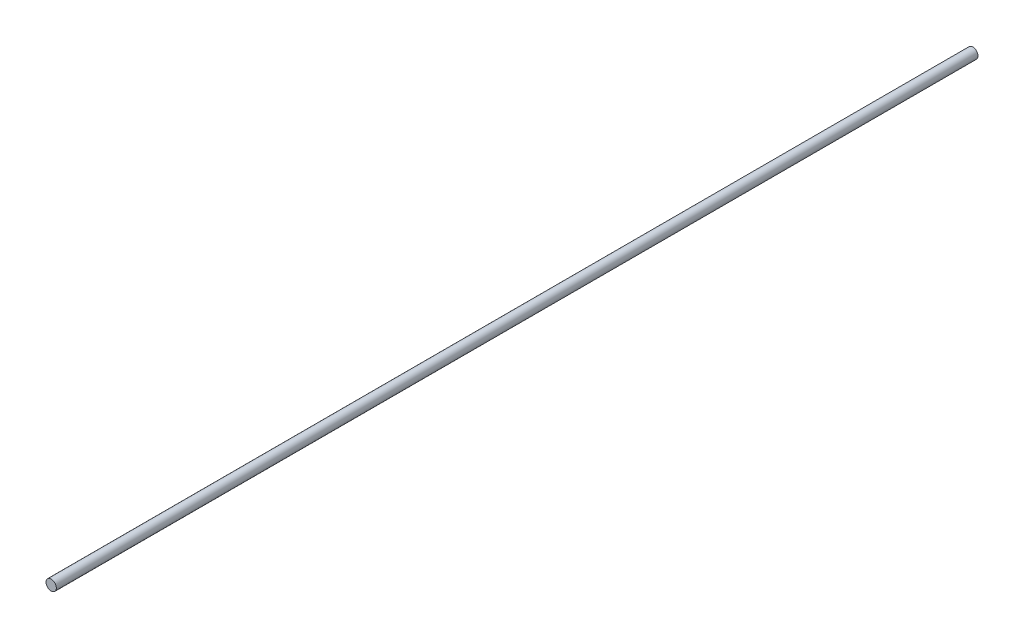
ISO-10303-21;
HEADER;
FILE_DESCRIPTION(('STEP AP214'),'2;1');
FILE_NAME('part.step','',(''),(''),'','','');
FILE_SCHEMA(('AUTOMOTIVE_DESIGN { 1 0 10303 214 1 1 1 1 }'));
ENDSEC;
DATA;
#1=APPLICATION_CONTEXT('core data for automotive mechanical design processes');
#2=APPLICATION_PROTOCOL_DEFINITION('international standard','automotive_design',2000,#1);
#3=PRODUCT_CONTEXT('',#1,'mechanical');
#4=PRODUCT('Part','Part','',(#3));
#5=PRODUCT_RELATED_PRODUCT_CATEGORY('part','',(#4));
#6=PRODUCT_DEFINITION_FORMATION('','',#4);
#7=PRODUCT_DEFINITION_CONTEXT('part definition',#1,'design');
#8=PRODUCT_DEFINITION('design','',#6,#7);
#9=PRODUCT_DEFINITION_SHAPE('','',#8);
#10=(LENGTH_UNIT() NAMED_UNIT(*) SI_UNIT(.MILLI.,.METRE.));
#11=(NAMED_UNIT(*) PLANE_ANGLE_UNIT() SI_UNIT($,.RADIAN.));
#12=(NAMED_UNIT(*) SI_UNIT($,.STERADIAN.) SOLID_ANGLE_UNIT());
#13=UNCERTAINTY_MEASURE_WITH_UNIT(LENGTH_MEASURE(1.E-05),#10,'distance_accuracy_value','');
#14=(GEOMETRIC_REPRESENTATION_CONTEXT(3) GLOBAL_UNCERTAINTY_ASSIGNED_CONTEXT((#13)) GLOBAL_UNIT_ASSIGNED_CONTEXT((#10,
#11,#12)) REPRESENTATION_CONTEXT('',''));
#15=CARTESIAN_POINT('',(0.,0.,0.));
#16=DIRECTION('',(0.,0.,1.));
#17=DIRECTION('',(1.,0.,0.));
#18=AXIS2_PLACEMENT_3D('',#15,#16,#17);
#19=CARTESIAN_POINT('',(0.,0.,-177.8));
#20=DIRECTION('',(0.,0.,1.));
#21=DIRECTION('',(1.,0.,0.));
#22=AXIS2_PLACEMENT_3D('',#19,#20,#21);
#23=CYLINDRICAL_SURFACE('',#22,1.);
#24=CARTESIAN_POINT('',(0.,0.,-177.8));
#25=DIRECTION('',(0.,0.,1.));
#26=DIRECTION('',(1.,0.,0.));
#27=AXIS2_PLACEMENT_3D('',#24,#25,#26);
#28=CIRCLE('',#27,1.);
#29=CARTESIAN_POINT('',(1.,0.,-177.8));
#30=VERTEX_POINT('',#29);
#31=EDGE_CURVE('E10',#30,#30,#28,.T.);
#32=ORIENTED_EDGE('',*,*,#31,.T.);
#33=EDGE_LOOP('',(#32));
#34=FACE_BOUND('',#33,.T.);
#35=CARTESIAN_POINT('',(0.,0.,0.));
#36=DIRECTION('',(0.,0.,1.));
#37=DIRECTION('',(1.,0.,0.));
#38=AXIS2_PLACEMENT_3D('',#35,#36,#37);
#39=CIRCLE('',#38,1.);
#40=CARTESIAN_POINT('',(1.,0.,0.));
#41=VERTEX_POINT('',#40);
#42=EDGE_CURVE('E40',#41,#41,#39,.T.);
#43=ORIENTED_EDGE('',*,*,#42,.F.);
#44=EDGE_LOOP('',(#43));
#45=FACE_BOUND('',#44,.T.);
#46=ADVANCED_FACE('F37',(#34,#45),#23,.T.);
#47=CARTESIAN_POINT('',(0.,0.,-177.8));
#48=DIRECTION('',(0.,0.,1.));
#49=DIRECTION('',(1.,0.,0.));
#50=AXIS2_PLACEMENT_3D('',#47,#48,#49);
#51=PLANE('',#50);
#52=ORIENTED_EDGE('',*,*,#31,.F.);
#53=EDGE_LOOP('',(#52));
#54=FACE_BOUND('',#53,.T.);
#55=ADVANCED_FACE('F54',(#54),#51,.F.);
#56=CARTESIAN_POINT('',(0.,0.,0.));
#57=DIRECTION('',(0.,0.,1.));
#58=DIRECTION('',(1.,0.,0.));
#59=AXIS2_PLACEMENT_3D('',#56,#57,#58);
#60=PLANE('',#59);
#61=ORIENTED_EDGE('',*,*,#42,.T.);
#62=EDGE_LOOP('',(#61));
#63=FACE_BOUND('',#62,.T.);
#64=ADVANCED_FACE('F51',(#63),#60,.T.);
#65=CLOSED_SHELL('',(#46,#55,#64));
#66=MANIFOLD_SOLID_BREP('B2',#65);
#67=ADVANCED_BREP_SHAPE_REPRESENTATION('',(#18,#66),#14);
#68=SHAPE_DEFINITION_REPRESENTATION(#9,#67);
ENDSEC;
END-ISO-10303-21;
